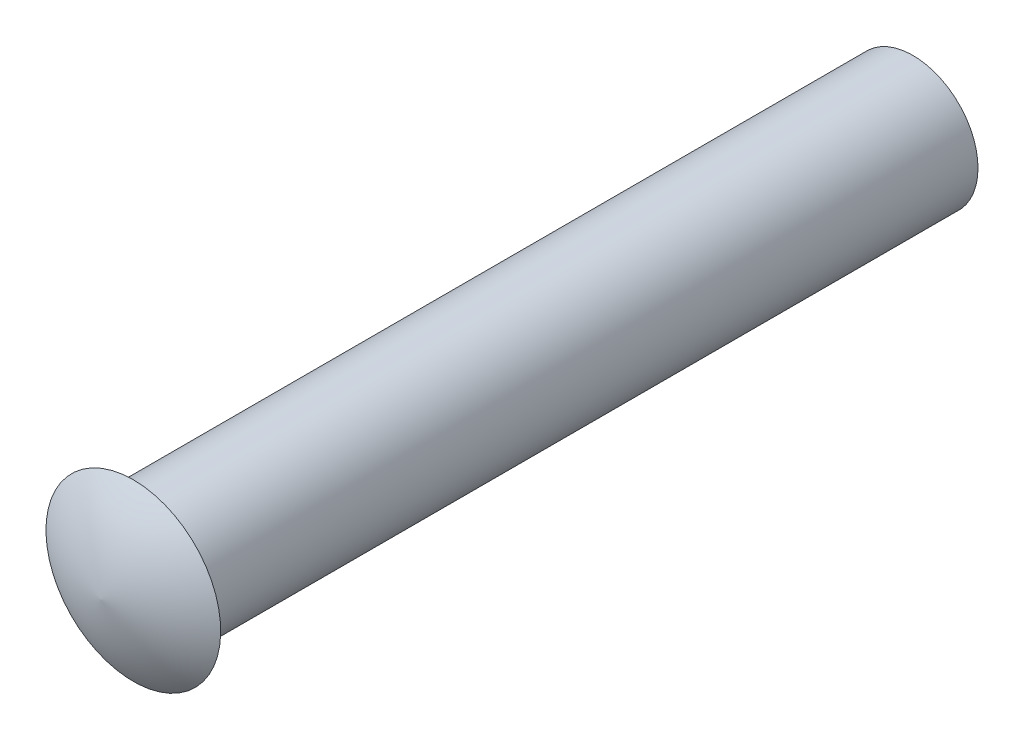
ISO-10303-21;
HEADER;
FILE_DESCRIPTION(('STEP AP214'),'2;1');
FILE_NAME('part.step','',(''),(''),'','','');
FILE_SCHEMA(('AUTOMOTIVE_DESIGN { 1 0 10303 214 1 1 1 1 }'));
ENDSEC;
DATA;
#1=APPLICATION_CONTEXT('core data for automotive mechanical design processes');
#2=APPLICATION_PROTOCOL_DEFINITION('international standard','automotive_design',2000,#1);
#3=PRODUCT_CONTEXT('',#1,'mechanical');
#4=PRODUCT('Part','Part','',(#3));
#5=PRODUCT_RELATED_PRODUCT_CATEGORY('part','',(#4));
#6=PRODUCT_DEFINITION_FORMATION('','',#4);
#7=PRODUCT_DEFINITION_CONTEXT('part definition',#1,'design');
#8=PRODUCT_DEFINITION('design','',#6,#7);
#9=PRODUCT_DEFINITION_SHAPE('','',#8);
#10=(LENGTH_UNIT() NAMED_UNIT(*) SI_UNIT(.MILLI.,.METRE.));
#11=(NAMED_UNIT(*) PLANE_ANGLE_UNIT() SI_UNIT($,.RADIAN.));
#12=(NAMED_UNIT(*) SI_UNIT($,.STERADIAN.) SOLID_ANGLE_UNIT());
#13=UNCERTAINTY_MEASURE_WITH_UNIT(LENGTH_MEASURE(1.E-05),#10,'distance_accuracy_value','');
#14=(GEOMETRIC_REPRESENTATION_CONTEXT(3) GLOBAL_UNCERTAINTY_ASSIGNED_CONTEXT((#13)) GLOBAL_UNIT_ASSIGNED_CONTEXT((#10,
#11,#12)) REPRESENTATION_CONTEXT('',''));
#15=CARTESIAN_POINT('',(0.,0.,0.));
#16=DIRECTION('',(0.,0.,1.));
#17=DIRECTION('',(1.,0.,0.));
#18=AXIS2_PLACEMENT_3D('',#15,#16,#17);
#19=CARTESIAN_POINT('',(0.,0.,-19.05));
#20=DIRECTION('',(0.,0.,1.));
#21=DIRECTION('',(1.,0.,0.));
#22=AXIS2_PLACEMENT_3D('',#19,#20,#21);
#23=CYLINDRICAL_SURFACE('',#22,1.59);
#24=CARTESIAN_POINT('',(0.,0.,-19.05));
#25=DIRECTION('',(0.,0.,1.));
#26=DIRECTION('',(1.,0.,0.));
#27=AXIS2_PLACEMENT_3D('',#24,#25,#26);
#28=CIRCLE('',#27,1.59);
#29=CARTESIAN_POINT('',(1.59,0.,-19.05));
#30=VERTEX_POINT('',#29);
#31=EDGE_CURVE('E11',#30,#30,#28,.T.);
#32=CARTESIAN_POINT('',(0.,0.,0.));
#33=DIRECTION('',(0.,0.,1.));
#34=DIRECTION('',(1.,0.,0.));
#35=AXIS2_PLACEMENT_3D('',#32,#33,#34);
#36=CIRCLE('',#35,1.59);
#37=CARTESIAN_POINT('',(1.59,0.,0.));
#38=VERTEX_POINT('',#37);
#39=EDGE_CURVE('E35',#38,#38,#36,.T.);
#40=CARTESIAN_POINT('',(1.59,0.,-19.05));
#41=CARTESIAN_POINT('',(1.59,0.,-18.8515625));
#42=CARTESIAN_POINT('',(1.59,0.,-18.653125));
#43=CARTESIAN_POINT('',(1.59,0.,-18.25625));
#44=CARTESIAN_POINT('',(1.59,0.,-18.0578125));
#45=CARTESIAN_POINT('',(1.59,0.,-17.6609375));
#46=CARTESIAN_POINT('',(1.59,0.,-17.4625));
#47=CARTESIAN_POINT('',(1.59,0.,-17.065625));
#48=CARTESIAN_POINT('',(1.59,0.,-16.8671875));
#49=CARTESIAN_POINT('',(1.59,0.,-16.4703125));
#50=CARTESIAN_POINT('',(1.59,0.,-16.271875));
#51=CARTESIAN_POINT('',(1.59,0.,-15.875));
#52=CARTESIAN_POINT('',(1.59,0.,-15.6765625));
#53=CARTESIAN_POINT('',(1.59,0.,-15.2796875));
#54=CARTESIAN_POINT('',(1.59,0.,-15.08125));
#55=CARTESIAN_POINT('',(1.59,0.,-14.684375));
#56=CARTESIAN_POINT('',(1.59,0.,-14.4859375));
#57=CARTESIAN_POINT('',(1.59,0.,-14.0890625));
#58=CARTESIAN_POINT('',(1.59,0.,-13.890625));
#59=CARTESIAN_POINT('',(1.59,0.,-13.49375));
#60=CARTESIAN_POINT('',(1.59,0.,-13.2953125));
#61=CARTESIAN_POINT('',(1.59,0.,-12.8984375));
#62=CARTESIAN_POINT('',(1.59,0.,-12.7));
#63=CARTESIAN_POINT('',(1.59,0.,-12.303125));
#64=CARTESIAN_POINT('',(1.59,0.,-12.1046875));
#65=CARTESIAN_POINT('',(1.59,0.,-11.7078125));
#66=CARTESIAN_POINT('',(1.59,0.,-11.509375));
#67=CARTESIAN_POINT('',(1.59,0.,-11.1125));
#68=CARTESIAN_POINT('',(1.59,0.,-10.9140625));
#69=CARTESIAN_POINT('',(1.59,0.,-10.5171875));
#70=CARTESIAN_POINT('',(1.59,0.,-10.31875));
#71=CARTESIAN_POINT('',(1.59,0.,-9.921875));
#72=CARTESIAN_POINT('',(1.59,0.,-9.7234375));
#73=CARTESIAN_POINT('',(1.59,0.,-9.3265625));
#74=CARTESIAN_POINT('',(1.59,0.,-9.128125));
#75=CARTESIAN_POINT('',(1.59,0.,-8.73125));
#76=CARTESIAN_POINT('',(1.59,0.,-8.5328125));
#77=CARTESIAN_POINT('',(1.59,0.,-8.1359375));
#78=CARTESIAN_POINT('',(1.59,0.,-7.9375));
#79=CARTESIAN_POINT('',(1.59,0.,-7.540625));
#80=CARTESIAN_POINT('',(1.59,0.,-7.3421875));
#81=CARTESIAN_POINT('',(1.59,0.,-6.9453125));
#82=CARTESIAN_POINT('',(1.59,0.,-6.746875));
#83=CARTESIAN_POINT('',(1.59,0.,-6.35));
#84=CARTESIAN_POINT('',(1.59,0.,-6.1515625));
#85=CARTESIAN_POINT('',(1.59,0.,-5.7546875));
#86=CARTESIAN_POINT('',(1.59,0.,-5.55625));
#87=CARTESIAN_POINT('',(1.59,0.,-5.159375));
#88=CARTESIAN_POINT('',(1.59,0.,-4.9609375));
#89=CARTESIAN_POINT('',(1.59,0.,-4.5640625));
#90=CARTESIAN_POINT('',(1.59,0.,-4.365625));
#91=CARTESIAN_POINT('',(1.59,0.,-3.96875));
#92=CARTESIAN_POINT('',(1.59,0.,-3.7703125));
#93=CARTESIAN_POINT('',(1.59,0.,-3.3734375));
#94=CARTESIAN_POINT('',(1.59,0.,-3.175));
#95=CARTESIAN_POINT('',(1.59,0.,-2.778125));
#96=CARTESIAN_POINT('',(1.59,0.,-2.5796875));
#97=CARTESIAN_POINT('',(1.59,0.,-2.1828125));
#98=CARTESIAN_POINT('',(1.59,0.,-1.984375));
#99=CARTESIAN_POINT('',(1.59,0.,-1.5875));
#100=CARTESIAN_POINT('',(1.59,0.,-1.3890625));
#101=CARTESIAN_POINT('',(1.59,0.,-0.992187500000001));
#102=CARTESIAN_POINT('',(1.59,0.,-0.793750000000001));
#103=CARTESIAN_POINT('',(1.59,0.,-0.396875));
#104=CARTESIAN_POINT('',(1.59,0.,-0.1984375));
#105=CARTESIAN_POINT('',(1.59,0.,0.));
#106=B_SPLINE_CURVE_WITH_KNOTS('',3,(#40,#41,#42,#43,#44,#45,#46,#47,#48,#49,#50,#51,#52,#53,
#54,#55,#56,#57,#58,#59,#60,#61,#62,#63,#64,#65,#66,#67,#68,#69,#70,#71,#72,#73,#74,#75,#76,#77,
#78,#79,#80,#81,#82,#83,#84,#85,#86,#87,#88,#89,#90,#91,#92,#93,#94,#95,#96,#97,#98,#99,#100,
#101,#102,#103,#104,#105),.UNSPECIFIED.,.F.,.F.,(4,2,2,2,2,2,2,2,2,2,2,2,2,2,2,2,2,2,2,2,2,2,2,
2,2,2,2,2,2,2,2,2,4),(0.,0.595312499999997,1.190625,1.7859375,2.38125,2.9765625,3.571875,
4.1671875,4.7625,5.3578125,5.953125,6.5484375,7.14375,7.7390625,8.334375,8.9296875,9.525,
10.1203125,10.715625,11.3109375,11.90625,12.5015625,13.096875,13.6921875,14.2875,14.8828125,
15.478125,16.0734375,16.66875,17.2640625,17.859375,18.4546875,19.05),.UNSPECIFIED.);
#107=EDGE_CURVE('BSEAM32',#30,#38,#106,.T.);
#108=ORIENTED_EDGE('',*,*,#31,.T.);
#109=ORIENTED_EDGE('',*,*,#39,.F.);
#110=ORIENTED_EDGE('',*,*,#107,.T.);
#111=ORIENTED_EDGE('',*,*,#107,.F.);
#112=EDGE_LOOP('',(#108,#110,#109,#111));
#113=FACE_BOUND('',#112,.T.);
#114=ADVANCED_FACE('F32',(#113),#23,.T.);
#115=CARTESIAN_POINT('',(0.,0.,-19.05));
#116=DIRECTION('',(0.,0.,1.));
#117=DIRECTION('',(1.,0.,0.));
#118=AXIS2_PLACEMENT_3D('',#115,#116,#117);
#119=PLANE('',#118);
#120=ORIENTED_EDGE('',*,*,#31,.F.);
#121=EDGE_LOOP('',(#120));
#122=FACE_BOUND('',#121,.T.);
#123=ADVANCED_FACE('F56',(#122),#119,.F.);
#124=CARTESIAN_POINT('',(0.,0.,0.));
#125=DIRECTION('',(0.,0.,-1.));
#126=DIRECTION('',(0.,1.,0.));
#127=AXIS2_PLACEMENT_3D('',#124,#125,#126);
#128=PLANE('',#127);
#129=ORIENTED_EDGE('',*,*,#39,.T.);
#130=EDGE_LOOP('',(#129));
#131=FACE_BOUND('',#130,.T.);
#132=CARTESIAN_POINT('',(0.,0.,0.));
#133=DIRECTION('',(0.,0.,-1.));
#134=DIRECTION('',(0.,1.,0.));
#135=AXIS2_PLACEMENT_3D('',#132,#133,#134);
#136=CIRCLE('',#135,2.135);
#137=CARTESIAN_POINT('',(0.,2.135,0.));
#138=VERTEX_POINT('',#137);
#139=EDGE_CURVE('E48',#138,#138,#136,.T.);
#140=ORIENTED_EDGE('',*,*,#139,.T.);
#141=EDGE_LOOP('',(#140));
#142=FACE_BOUND('',#141,.T.);
#143=ADVANCED_FACE('F44',(#131,#142),#128,.T.);
#144=CARTESIAN_POINT('',(0.,-0.44169204254032,-3.68363925420707));
#145=DIRECTION('',(-1.,0.,0.));
#146=DIRECTION('',(0.,1.,0.));
#147=AXIS2_PLACEMENT_3D('',#144,#145,#146);
#148=CIRCLE('',#147,4.49539097712599);
#149=TRIMMED_CURVE('',#148,(PARAMETER_VALUE(-1.47238312369975)),
(PARAMETER_VALUE(1.47238312369975)),.T.,.PARAMETER.);
#150=CARTESIAN_POINT('',(0.,0.,-3.68363925420707));
#151=DIRECTION('',(0.,0.,-1.));
#152=AXIS1_PLACEMENT('',#150,#151);
#153=SURFACE_OF_REVOLUTION('',#149,#152);
#154=CARTESIAN_POINT('',(0.,0.,0.79));
#155=VERTEX_POINT('',#154);
#156=VERTEX_LOOP('',#155);
#157=FACE_BOUND('',#156,.T.);
#158=ORIENTED_EDGE('',*,*,#139,.F.);
#159=EDGE_LOOP('',(#158));
#160=FACE_BOUND('',#159,.T.);
#161=ADVANCED_FACE('F41',(#157,#160),#153,.T.);
#162=CLOSED_SHELL('',(#114,#123,#143,#161));
#163=MANIFOLD_SOLID_BREP('B2',#162);
#164=ADVANCED_BREP_SHAPE_REPRESENTATION('',(#18,#163),#14);
#165=SHAPE_DEFINITION_REPRESENTATION(#9,#164);
ENDSEC;
END-ISO-10303-21;
